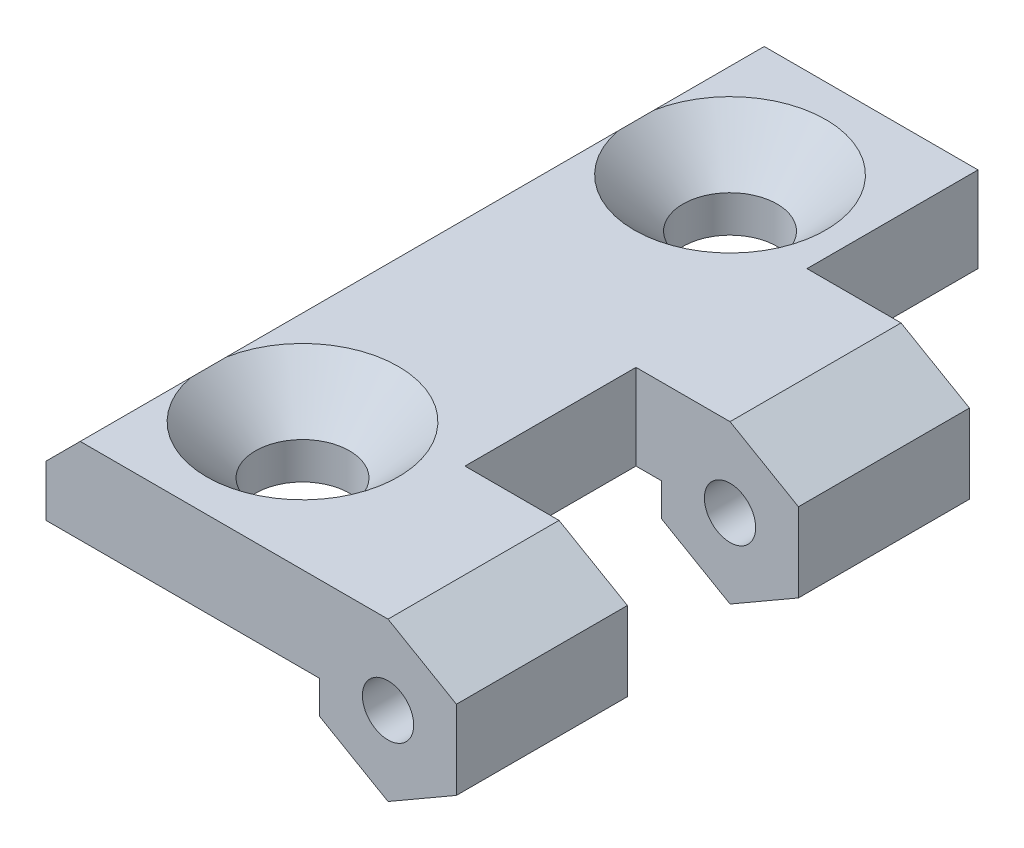
ISO-10303-21;
HEADER;
FILE_DESCRIPTION(('STEP AP214'),'2;1');
FILE_NAME('part.step','',(''),(''),'','','');
FILE_SCHEMA(('AUTOMOTIVE_DESIGN { 1 0 10303 214 1 1 1 1 }'));
ENDSEC;
DATA;
#1=APPLICATION_CONTEXT('core data for automotive mechanical design processes');
#2=APPLICATION_PROTOCOL_DEFINITION('international standard','automotive_design',2000,#1);
#3=PRODUCT_CONTEXT('',#1,'mechanical');
#4=PRODUCT('Part','Part','',(#3));
#5=PRODUCT_RELATED_PRODUCT_CATEGORY('part','',(#4));
#6=PRODUCT_DEFINITION_FORMATION('','',#4);
#7=PRODUCT_DEFINITION_CONTEXT('part definition',#1,'design');
#8=PRODUCT_DEFINITION('design','',#6,#7);
#9=PRODUCT_DEFINITION_SHAPE('','',#8);
#10=(LENGTH_UNIT() NAMED_UNIT(*) SI_UNIT(.MILLI.,.METRE.));
#11=(NAMED_UNIT(*) PLANE_ANGLE_UNIT() SI_UNIT($,.RADIAN.));
#12=(NAMED_UNIT(*) SI_UNIT($,.STERADIAN.) SOLID_ANGLE_UNIT());
#13=UNCERTAINTY_MEASURE_WITH_UNIT(LENGTH_MEASURE(1.E-05),#10,'distance_accuracy_value','');
#14=(GEOMETRIC_REPRESENTATION_CONTEXT(3) GLOBAL_UNCERTAINTY_ASSIGNED_CONTEXT((#13)) GLOBAL_UNIT_ASSIGNED_CONTEXT((#10,
#11,#12)) REPRESENTATION_CONTEXT('',''));
#15=CARTESIAN_POINT('',(0.,0.,0.));
#16=DIRECTION('',(0.,0.,1.));
#17=DIRECTION('',(1.,0.,0.));
#18=AXIS2_PLACEMENT_3D('',#15,#16,#17);
#19=CARTESIAN_POINT('',(0.,0.,-10.));
#20=DIRECTION('',(0.,0.,1.));
#21=DIRECTION('',(1.,0.,0.));
#22=AXIS2_PLACEMENT_3D('',#19,#20,#21);
#23=PLANE('',#22);
#24=CARTESIAN_POINT('',(10.,0.381197846482994,-10.));
#25=DIRECTION('',(0.,0.,-1.));
#26=DIRECTION('',(-1.,0.,0.));
#27=AXIS2_PLACEMENT_3D('',#24,#25,#26);
#28=CIRCLE('',#27,1.49999999999999);
#29=CARTESIAN_POINT('',(8.50000000000001,0.381197846482994,-10.));
#30=VERTEX_POINT('',#29);
#31=EDGE_CURVE('E517',#30,#30,#28,.T.);
#32=ORIENTED_EDGE('',*,*,#31,.F.);
#33=EDGE_LOOP('',(#32));
#34=FACE_BOUND('',#33,.T.);
#35=DIRECTION('',(0.,-1.,0.));
#36=VECTOR('',#35,1.);
#37=CARTESIAN_POINT('',(4.5,0.,-10.));
#38=LINE('',#37,#36);
#39=CARTESIAN_POINT('',(4.5,5.,-10.));
#40=VERTEX_POINT('',#39);
#41=CARTESIAN_POINT('',(4.5,0.,-10.));
#42=VERTEX_POINT('',#41);
#43=EDGE_CURVE('E200',#40,#42,#38,.T.);
#44=ORIENTED_EDGE('',*,*,#43,.F.);
#45=DIRECTION('',(-1.,0.,0.));
#46=VECTOR('',#45,1.);
#47=CARTESIAN_POINT('',(10.,5.,-10.));
#48=LINE('',#47,#46);
#49=CARTESIAN_POINT('',(10.,5.,-10.));
#50=VERTEX_POINT('',#49);
#51=EDGE_CURVE('E288',#50,#40,#48,.T.);
#52=ORIENTED_EDGE('',*,*,#51,.F.);
#53=DIRECTION('',(-0.866025403784439,0.499999999999999,0.));
#54=VECTOR('',#53,1.);
#55=CARTESIAN_POINT('',(14.,2.6905989232415,-10.));
#56=LINE('',#55,#54);
#57=CARTESIAN_POINT('',(14.,2.6905989232415,-10.));
#58=VERTEX_POINT('',#57);
#59=EDGE_CURVE('E285',#58,#50,#56,.T.);
#60=ORIENTED_EDGE('',*,*,#59,.F.);
#61=DIRECTION('',(0.,1.,0.));
#62=VECTOR('',#61,1.);
#63=CARTESIAN_POINT('',(14.,-1.92820323027551,-10.));
#64=LINE('',#63,#62);
#65=CARTESIAN_POINT('',(14.,-1.92820323027551,-10.));
#66=VERTEX_POINT('',#65);
#67=EDGE_CURVE('E298',#66,#58,#64,.T.);
#68=ORIENTED_EDGE('',*,*,#67,.F.);
#69=DIRECTION('',(0.866025403784439,0.5,0.));
#70=VECTOR('',#69,1.);
#71=CARTESIAN_POINT('',(10.,-4.23760430703401,-10.));
#72=LINE('',#71,#70);
#73=CARTESIAN_POINT('',(10.,-4.23760430703401,-10.));
#74=VERTEX_POINT('',#73);
#75=EDGE_CURVE('E295',#74,#66,#72,.T.);
#76=ORIENTED_EDGE('',*,*,#75,.F.);
#77=DIRECTION('',(0.866025403784439,-0.5,0.));
#78=VECTOR('',#77,1.);
#79=CARTESIAN_POINT('',(6.,-1.92820323027551,-10.));
#80=LINE('',#79,#78);
#81=CARTESIAN_POINT('',(6.,-1.92820323027551,-10.));
#82=VERTEX_POINT('',#81);
#83=EDGE_CURVE('E292',#82,#74,#80,.T.);
#84=ORIENTED_EDGE('',*,*,#83,.F.);
#85=DIRECTION('',(0.,-1.,0.));
#86=VECTOR('',#85,1.);
#87=CARTESIAN_POINT('',(6.,0.,-10.));
#88=LINE('',#87,#86);
#89=CARTESIAN_POINT('',(6.,0.,-10.));
#90=VERTEX_POINT('',#89);
#91=EDGE_CURVE('E271',#90,#82,#88,.T.);
#92=ORIENTED_EDGE('',*,*,#91,.F.);
#93=DIRECTION('',(1.,0.,0.));
#94=VECTOR('',#93,1.);
#95=CARTESIAN_POINT('',(-10.,0.,-10.));
#96=LINE('',#95,#94);
#97=EDGE_CURVE('E187',#42,#90,#96,.T.);
#98=ORIENTED_EDGE('',*,*,#97,.F.);
#99=EDGE_LOOP('',(#44,#52,#60,#68,#76,#84,#92,#98));
#100=FACE_BOUND('',#99,.T.);
#101=ADVANCED_FACE('F35',(#34,#100),#23,.F.);
#102=CARTESIAN_POINT('',(14.,2.6905989232415,-10.));
#103=DIRECTION('',(0.499999999999999,0.866025403784439,0.));
#104=DIRECTION('',(-0.866025403784439,0.499999999999999,0.));
#105=AXIS2_PLACEMENT_3D('',#102,#103,#104);
#106=PLANE('',#105);
#107=DIRECTION('',(-0.866025403784439,0.499999999999999,0.));
#108=VECTOR('',#107,1.);
#109=CARTESIAN_POINT('',(14.,2.6905989232415,0.));
#110=LINE('',#109,#108);
#111=CARTESIAN_POINT('',(14.,2.6905989232415,0.));
#112=VERTEX_POINT('',#111);
#113=CARTESIAN_POINT('',(10.,5.,0.));
#114=VERTEX_POINT('',#113);
#115=EDGE_CURVE('E284',#112,#114,#110,.T.);
#116=ORIENTED_EDGE('',*,*,#115,.F.);
#117=DIRECTION('',(0.,0.,1.));
#118=VECTOR('',#117,1.);
#119=CARTESIAN_POINT('',(14.,2.6905989232415,-10.));
#120=LINE('',#119,#118);
#121=EDGE_CURVE('E315',#58,#112,#120,.T.);
#122=ORIENTED_EDGE('',*,*,#121,.F.);
#123=ORIENTED_EDGE('',*,*,#59,.T.);
#124=DIRECTION('',(0.,0.,1.));
#125=VECTOR('',#124,1.);
#126=CARTESIAN_POINT('',(10.,5.,-10.));
#127=LINE('',#126,#125);
#128=EDGE_CURVE('E301',#50,#114,#127,.T.);
#129=ORIENTED_EDGE('',*,*,#128,.T.);
#130=EDGE_LOOP('',(#116,#122,#123,#129));
#131=FACE_BOUND('',#130,.T.);
#132=ADVANCED_FACE('F426',(#131),#106,.T.);
#133=CARTESIAN_POINT('',(14.,-1.92820323027551,-10.));
#134=DIRECTION('',(1.,0.,0.));
#135=DIRECTION('',(0.,1.,0.));
#136=AXIS2_PLACEMENT_3D('',#133,#134,#135);
#137=PLANE('',#136);
#138=DIRECTION('',(0.,1.,0.));
#139=VECTOR('',#138,1.);
#140=CARTESIAN_POINT('',(14.,-1.92820323027551,0.));
#141=LINE('',#140,#139);
#142=CARTESIAN_POINT('',(14.,-1.92820323027551,0.));
#143=VERTEX_POINT('',#142);
#144=EDGE_CURVE('E289',#143,#112,#141,.T.);
#145=ORIENTED_EDGE('',*,*,#144,.F.);
#146=DIRECTION('',(0.,0.,1.));
#147=VECTOR('',#146,1.);
#148=CARTESIAN_POINT('',(14.,-1.92820323027551,-10.));
#149=LINE('',#148,#147);
#150=EDGE_CURVE('E318',#66,#143,#149,.T.);
#151=ORIENTED_EDGE('',*,*,#150,.F.);
#152=ORIENTED_EDGE('',*,*,#67,.T.);
#153=ORIENTED_EDGE('',*,*,#121,.T.);
#154=EDGE_LOOP('',(#145,#151,#152,#153));
#155=FACE_BOUND('',#154,.T.);
#156=ADVANCED_FACE('F432',(#155),#137,.T.);
#157=CARTESIAN_POINT('',(10.,-4.23760430703401,-10.));
#158=DIRECTION('',(0.5,-0.866025403784438,0.));
#159=DIRECTION('',(0.866025403784439,0.5,0.));
#160=AXIS2_PLACEMENT_3D('',#157,#158,#159);
#161=PLANE('',#160);
#162=DIRECTION('',(0.866025403784439,0.5,0.));
#163=VECTOR('',#162,1.);
#164=CARTESIAN_POINT('',(10.,-4.23760430703401,0.));
#165=LINE('',#164,#163);
#166=CARTESIAN_POINT('',(10.,-4.23760430703401,0.));
#167=VERTEX_POINT('',#166);
#168=EDGE_CURVE('E310',#167,#143,#165,.T.);
#169=ORIENTED_EDGE('',*,*,#168,.F.);
#170=DIRECTION('',(0.,0.,1.));
#171=VECTOR('',#170,1.);
#172=CARTESIAN_POINT('',(10.,-4.23760430703401,-10.));
#173=LINE('',#172,#171);
#174=EDGE_CURVE('E320',#74,#167,#173,.T.);
#175=ORIENTED_EDGE('',*,*,#174,.F.);
#176=ORIENTED_EDGE('',*,*,#75,.T.);
#177=ORIENTED_EDGE('',*,*,#150,.T.);
#178=EDGE_LOOP('',(#169,#175,#176,#177));
#179=FACE_BOUND('',#178,.T.);
#180=ADVANCED_FACE('F435',(#179),#161,.T.);
#181=CARTESIAN_POINT('',(6.,-1.92820323027551,-10.));
#182=DIRECTION('',(-0.5,-0.866025403784439,0.));
#183=DIRECTION('',(0.866025403784439,-0.5,0.));
#184=AXIS2_PLACEMENT_3D('',#181,#182,#183);
#185=PLANE('',#184);
#186=DIRECTION('',(0.866025403784439,-0.5,0.));
#187=VECTOR('',#186,1.);
#188=CARTESIAN_POINT('',(6.,-1.92820323027551,0.));
#189=LINE('',#188,#187);
#190=CARTESIAN_POINT('',(6.,-1.92820323027551,0.));
#191=VERTEX_POINT('',#190);
#192=EDGE_CURVE('E307',#191,#167,#189,.T.);
#193=ORIENTED_EDGE('',*,*,#192,.F.);
#194=DIRECTION('',(0.,0.,1.));
#195=VECTOR('',#194,1.);
#196=CARTESIAN_POINT('',(6.,-1.92820323027551,-10.));
#197=LINE('',#196,#195);
#198=EDGE_CURVE('E322',#82,#191,#197,.T.);
#199=ORIENTED_EDGE('',*,*,#198,.F.);
#200=ORIENTED_EDGE('',*,*,#83,.T.);
#201=ORIENTED_EDGE('',*,*,#174,.T.);
#202=EDGE_LOOP('',(#193,#199,#200,#201));
#203=FACE_BOUND('',#202,.T.);
#204=ADVANCED_FACE('F439',(#203),#185,.T.);
#205=CARTESIAN_POINT('',(-9.99999999999999,5.,-10.));
#206=DIRECTION('',(-1.,0.,0.));
#207=DIRECTION('',(0.,-1.,0.));
#208=AXIS2_PLACEMENT_3D('',#205,#206,#207);
#209=PLANE('',#208);
#210=DIRECTION('',(0.,-1.,0.));
#211=VECTOR('',#210,1.);
#212=CARTESIAN_POINT('',(-10.,0.,20.));
#213=LINE('',#212,#211);
#214=CARTESIAN_POINT('',(-9.99999999999999,2.99999999999999,20.));
#215=VERTEX_POINT('',#214);
#216=CARTESIAN_POINT('',(-10.,0.,20.));
#217=VERTEX_POINT('',#216);
#218=EDGE_CURVE('E216',#215,#217,#213,.T.);
#219=ORIENTED_EDGE('',*,*,#218,.F.);
#220=DIRECTION('',(0.,0.,-1.));
#221=VECTOR('',#220,1.);
#222=CARTESIAN_POINT('',(-10.,2.99999999999999,-10.));
#223=LINE('',#222,#221);
#224=CARTESIAN_POINT('',(-10.,2.99999999999999,-20.));
#225=VERTEX_POINT('',#224);
#226=EDGE_CURVE('E44',#215,#225,#223,.T.);
#227=ORIENTED_EDGE('',*,*,#226,.T.);
#228=DIRECTION('',(0.,1.,0.));
#229=VECTOR('',#228,1.);
#230=CARTESIAN_POINT('',(-10.,5.,-20.));
#231=LINE('',#230,#229);
#232=CARTESIAN_POINT('',(-10.,0.,-20.));
#233=VERTEX_POINT('',#232);
#234=EDGE_CURVE('E190',#233,#225,#231,.T.);
#235=ORIENTED_EDGE('',*,*,#234,.F.);
#236=DIRECTION('',(0.,0.,-1.));
#237=VECTOR('',#236,1.);
#238=CARTESIAN_POINT('',(-10.,0.,10.));
#239=LINE('',#238,#237);
#240=EDGE_CURVE('E180',#217,#233,#239,.T.);
#241=ORIENTED_EDGE('',*,*,#240,.F.);
#242=EDGE_LOOP('',(#219,#227,#235,#241));
#243=FACE_BOUND('',#242,.T.);
#244=ADVANCED_FACE('F191',(#243),#209,.T.);
#245=CARTESIAN_POINT('',(10.,5.,-10.));
#246=DIRECTION('',(0.,1.,0.));
#247=DIRECTION('',(-1.,0.,0.));
#248=AXIS2_PLACEMENT_3D('',#245,#246,#247);
#249=PLANE('',#248);
#250=DIRECTION('',(1.,0.,0.));
#251=VECTOR('',#250,1.);
#252=CARTESIAN_POINT('',(4.5,5.,-20.));
#253=LINE('',#252,#251);
#254=CARTESIAN_POINT('',(-7.99999999999999,5.,-20.));
#255=VERTEX_POINT('',#254);
#256=CARTESIAN_POINT('',(4.5,5.,-20.));
#257=VERTEX_POINT('',#256);
#258=EDGE_CURVE('E194',#255,#257,#253,.T.);
#259=ORIENTED_EDGE('',*,*,#258,.F.);
#260=DIRECTION('',(0.,0.,1.));
#261=VECTOR('',#260,1.);
#262=CARTESIAN_POINT('',(-7.99999999999999,5.,-10.));
#263=LINE('',#262,#261);
#264=CARTESIAN_POINT('',(-7.99999999999999,5.,-13.5535653751253));
#265=VERTEX_POINT('',#264);
#266=EDGE_CURVE('E338',#255,#265,#263,.T.);
#267=ORIENTED_EDGE('',*,*,#266,.T.);
#268=CARTESIAN_POINT('',(-2.49999999999999,5.,-12.5));
#269=DIRECTION('',(0.,1.,0.));
#270=DIRECTION('',(0.,0.,1.));
#271=AXIS2_PLACEMENT_3D('',#268,#269,#270);
#272=CIRCLE('',#271,5.5999999999699);
#273=CARTESIAN_POINT('',(-7.99999999999999,5.,-11.4464346248747));
#274=VERTEX_POINT('',#273);
#275=EDGE_CURVE('E511',#274,#265,#272,.T.);
#276=ORIENTED_EDGE('',*,*,#275,.F.);
#277=DIRECTION('',(0.,0.,1.));
#278=VECTOR('',#277,1.);
#279=CARTESIAN_POINT('',(-7.99999999999999,5.,-10.));
#280=LINE('',#279,#278);
#281=CARTESIAN_POINT('',(-7.99999999999999,5.,11.4464346248747));
#282=VERTEX_POINT('',#281);
#283=EDGE_CURVE('E336',#274,#282,#280,.T.);
#284=ORIENTED_EDGE('',*,*,#283,.T.);
#285=CARTESIAN_POINT('',(-2.49999999999999,5.,12.5));
#286=DIRECTION('',(0.,1.,0.));
#287=DIRECTION('',(0.,0.,1.));
#288=AXIS2_PLACEMENT_3D('',#285,#286,#287);
#289=CIRCLE('',#288,5.5999999999699);
#290=CARTESIAN_POINT('',(-7.99999999999999,5.,13.5535653751253));
#291=VERTEX_POINT('',#290);
#292=EDGE_CURVE('E333',#291,#282,#289,.T.);
#293=ORIENTED_EDGE('',*,*,#292,.F.);
#294=DIRECTION('',(0.,0.,1.));
#295=VECTOR('',#294,1.);
#296=CARTESIAN_POINT('',(-7.99999999999999,5.,-10.));
#297=LINE('',#296,#295);
#298=CARTESIAN_POINT('',(-7.99999999999999,5.,20.));
#299=VERTEX_POINT('',#298);
#300=EDGE_CURVE('E317',#291,#299,#297,.T.);
#301=ORIENTED_EDGE('',*,*,#300,.T.);
#302=DIRECTION('',(-1.,0.,0.));
#303=VECTOR('',#302,1.);
#304=CARTESIAN_POINT('',(-9.99999999999999,5.,20.));
#305=LINE('',#304,#303);
#306=CARTESIAN_POINT('',(10.,5.,20.));
#307=VERTEX_POINT('',#306);
#308=EDGE_CURVE('E230',#307,#299,#305,.T.);
#309=ORIENTED_EDGE('',*,*,#308,.F.);
#310=DIRECTION('',(0.,0.,-1.));
#311=VECTOR('',#310,1.);
#312=CARTESIAN_POINT('',(10.,5.,20.));
#313=LINE('',#312,#311);
#314=CARTESIAN_POINT('',(10.,5.,10.));
#315=VERTEX_POINT('',#314);
#316=EDGE_CURVE('E232',#307,#315,#313,.T.);
#317=ORIENTED_EDGE('',*,*,#316,.T.);
#318=DIRECTION('',(-1.,0.,0.));
#319=VECTOR('',#318,1.);
#320=CARTESIAN_POINT('',(-9.99999999999999,5.,10.));
#321=LINE('',#320,#319);
#322=CARTESIAN_POINT('',(4.5,5.,10.));
#323=VERTEX_POINT('',#322);
#324=EDGE_CURVE('E218',#315,#323,#321,.T.);
#325=ORIENTED_EDGE('',*,*,#324,.T.);
#326=DIRECTION('',(0.,0.,1.));
#327=VECTOR('',#326,1.);
#328=CARTESIAN_POINT('',(4.5,5.,0.));
#329=LINE('',#328,#327);
#330=CARTESIAN_POINT('',(4.5,5.,0.));
#331=VERTEX_POINT('',#330);
#332=EDGE_CURVE('E275',#331,#323,#329,.T.);
#333=ORIENTED_EDGE('',*,*,#332,.F.);
#334=DIRECTION('',(-1.,0.,0.));
#335=VECTOR('',#334,1.);
#336=CARTESIAN_POINT('',(10.,5.,0.));
#337=LINE('',#336,#335);
#338=EDGE_CURVE('E304',#114,#331,#337,.T.);
#339=ORIENTED_EDGE('',*,*,#338,.F.);
#340=ORIENTED_EDGE('',*,*,#128,.F.);
#341=ORIENTED_EDGE('',*,*,#51,.T.);
#342=DIRECTION('',(0.,0.,1.));
#343=VECTOR('',#342,1.);
#344=CARTESIAN_POINT('',(4.5,5.,-20.));
#345=LINE('',#344,#343);
#346=EDGE_CURVE('E212',#257,#40,#345,.T.);
#347=ORIENTED_EDGE('',*,*,#346,.F.);
#348=EDGE_LOOP('',(#259,#267,#276,#284,#293,#301,#309,#317,#325,#333,#339,#340,#341,#347));
#349=FACE_BOUND('',#348,.T.);
#350=ADVANCED_FACE('F430',(#349),#249,.T.);
#351=CARTESIAN_POINT('',(0.,0.,0.));
#352=DIRECTION('',(0.,0.,1.));
#353=DIRECTION('',(1.,0.,0.));
#354=AXIS2_PLACEMENT_3D('',#351,#352,#353);
#355=PLANE('',#354);
#356=CARTESIAN_POINT('',(10.,0.381197846482994,0.));
#357=DIRECTION('',(0.,0.,1.));
#358=DIRECTION('',(1.,0.,0.));
#359=AXIS2_PLACEMENT_3D('',#356,#357,#358);
#360=CIRCLE('',#359,1.49999999999999);
#361=CARTESIAN_POINT('',(11.5,0.381197846482994,0.));
#362=VERTEX_POINT('',#361);
#363=EDGE_CURVE('E514',#362,#362,#360,.T.);
#364=ORIENTED_EDGE('',*,*,#363,.F.);
#365=EDGE_LOOP('',(#364));
#366=FACE_BOUND('',#365,.T.);
#367=DIRECTION('',(0.,-1.,0.));
#368=VECTOR('',#367,1.);
#369=CARTESIAN_POINT('',(6.,0.,0.));
#370=LINE('',#369,#368);
#371=CARTESIAN_POINT('',(6.,0.,0.));
#372=VERTEX_POINT('',#371);
#373=EDGE_CURVE('E272',#372,#191,#370,.T.);
#374=ORIENTED_EDGE('',*,*,#373,.T.);
#375=ORIENTED_EDGE('',*,*,#192,.T.);
#376=ORIENTED_EDGE('',*,*,#168,.T.);
#377=ORIENTED_EDGE('',*,*,#144,.T.);
#378=ORIENTED_EDGE('',*,*,#115,.T.);
#379=ORIENTED_EDGE('',*,*,#338,.T.);
#380=DIRECTION('',(0.,1.,0.));
#381=VECTOR('',#380,1.);
#382=CARTESIAN_POINT('',(4.5,-1.92820323027551,0.));
#383=LINE('',#382,#381);
#384=CARTESIAN_POINT('',(4.5,0.,0.));
#385=VERTEX_POINT('',#384);
#386=EDGE_CURVE('E282',#385,#331,#383,.T.);
#387=ORIENTED_EDGE('',*,*,#386,.F.);
#388=DIRECTION('',(-1.,0.,0.));
#389=VECTOR('',#388,1.);
#390=CARTESIAN_POINT('',(6.,0.,0.));
#391=LINE('',#390,#389);
#392=EDGE_CURVE('E263',#372,#385,#391,.T.);
#393=ORIENTED_EDGE('',*,*,#392,.F.);
#394=EDGE_LOOP('',(#374,#375,#376,#377,#378,#379,#387,#393));
#395=FACE_BOUND('',#394,.T.);
#396=ADVANCED_FACE('F422',(#366,#395),#355,.T.);
#397=CARTESIAN_POINT('',(4.5,0.,0.));
#398=DIRECTION('',(1.,0.,0.));
#399=DIRECTION('',(0.,1.,0.));
#400=AXIS2_PLACEMENT_3D('',#397,#398,#399);
#401=PLANE('',#400);
#402=DIRECTION('',(0.,0.,1.));
#403=VECTOR('',#402,1.);
#404=CARTESIAN_POINT('',(4.5,0.,0.));
#405=LINE('',#404,#403);
#406=CARTESIAN_POINT('',(4.5,0.,10.));
#407=VERTEX_POINT('',#406);
#408=EDGE_CURVE('E188',#385,#407,#405,.T.);
#409=ORIENTED_EDGE('',*,*,#408,.F.);
#410=ORIENTED_EDGE('',*,*,#386,.T.);
#411=ORIENTED_EDGE('',*,*,#332,.T.);
#412=DIRECTION('',(0.,-1.,0.));
#413=VECTOR('',#412,1.);
#414=CARTESIAN_POINT('',(4.5,5.,10.));
#415=LINE('',#414,#413);
#416=EDGE_CURVE('E279',#323,#407,#415,.T.);
#417=ORIENTED_EDGE('',*,*,#416,.T.);
#418=EDGE_LOOP('',(#409,#410,#411,#417));
#419=FACE_BOUND('',#418,.T.);
#420=ADVANCED_FACE('F418',(#419),#401,.T.);
#421=CARTESIAN_POINT('',(6.,0.,-10.));
#422=DIRECTION('',(1.,0.,0.));
#423=DIRECTION('',(0.,0.,-1.));
#424=AXIS2_PLACEMENT_3D('',#421,#422,#423);
#425=PLANE('',#424);
#426=ORIENTED_EDGE('',*,*,#198,.T.);
#427=ORIENTED_EDGE('',*,*,#373,.F.);
#428=DIRECTION('',(0.,0.,1.));
#429=VECTOR('',#428,1.);
#430=CARTESIAN_POINT('',(6.,0.,-10.));
#431=LINE('',#430,#429);
#432=EDGE_CURVE('E268',#90,#372,#431,.T.);
#433=ORIENTED_EDGE('',*,*,#432,.F.);
#434=ORIENTED_EDGE('',*,*,#91,.T.);
#435=EDGE_LOOP('',(#426,#427,#433,#434));
#436=FACE_BOUND('',#435,.T.);
#437=ADVANCED_FACE('F414',(#436),#425,.F.);
#438=CARTESIAN_POINT('',(0.,0.,0.));
#439=DIRECTION('',(0.,1.,0.));
#440=DIRECTION('',(0.,0.,1.));
#441=AXIS2_PLACEMENT_3D('',#438,#439,#440);
#442=PLANE('',#441);
#443=CARTESIAN_POINT('',(-2.49999999999999,0.,-12.5));
#444=DIRECTION('',(0.,1.,0.));
#445=DIRECTION('',(0.,0.,1.));
#446=AXIS2_PLACEMENT_3D('',#443,#444,#445);
#447=CIRCLE('',#446,2.74999999999999);
#448=CARTESIAN_POINT('',(-2.49999999999999,0.,-9.75000000000002));
#449=VERTEX_POINT('',#448);
#450=EDGE_CURVE('E330',#449,#449,#447,.T.);
#451=ORIENTED_EDGE('',*,*,#450,.T.);
#452=EDGE_LOOP('',(#451));
#453=FACE_BOUND('',#452,.T.);
#454=CARTESIAN_POINT('',(-2.49999999999999,0.,12.5));
#455=DIRECTION('',(0.,1.,0.));
#456=DIRECTION('',(0.,0.,1.));
#457=AXIS2_PLACEMENT_3D('',#454,#455,#456);
#458=CIRCLE('',#457,2.74999999999999);
#459=CARTESIAN_POINT('',(-2.49999999999999,0.,15.25));
#460=VERTEX_POINT('',#459);
#461=EDGE_CURVE('E325',#460,#460,#458,.T.);
#462=ORIENTED_EDGE('',*,*,#461,.T.);
#463=EDGE_LOOP('',(#462));
#464=FACE_BOUND('',#463,.T.);
#465=ORIENTED_EDGE('',*,*,#392,.T.);
#466=ORIENTED_EDGE('',*,*,#408,.T.);
#467=DIRECTION('',(1.,0.,0.));
#468=VECTOR('',#467,1.);
#469=CARTESIAN_POINT('',(6.,0.,10.));
#470=LINE('',#469,#468);
#471=CARTESIAN_POINT('',(6.,0.,10.));
#472=VERTEX_POINT('',#471);
#473=EDGE_CURVE('E215',#407,#472,#470,.T.);
#474=ORIENTED_EDGE('',*,*,#473,.T.);
#475=DIRECTION('',(0.,0.,-1.));
#476=VECTOR('',#475,1.);
#477=CARTESIAN_POINT('',(6.,0.,20.));
#478=LINE('',#477,#476);
#479=CARTESIAN_POINT('',(6.,0.,20.));
#480=VERTEX_POINT('',#479);
#481=EDGE_CURVE('E260',#480,#472,#478,.T.);
#482=ORIENTED_EDGE('',*,*,#481,.F.);
#483=DIRECTION('',(1.,0.,0.));
#484=VECTOR('',#483,1.);
#485=CARTESIAN_POINT('',(6.,0.,20.));
#486=LINE('',#485,#484);
#487=EDGE_CURVE('E186',#217,#480,#486,.T.);
#488=ORIENTED_EDGE('',*,*,#487,.F.);
#489=ORIENTED_EDGE('',*,*,#240,.T.);
#490=DIRECTION('',(-1.,0.,0.));
#491=VECTOR('',#490,1.);
#492=CARTESIAN_POINT('',(-10.,0.,-20.));
#493=LINE('',#492,#491);
#494=CARTESIAN_POINT('',(4.5,0.,-20.));
#495=VERTEX_POINT('',#494);
#496=EDGE_CURVE('E184',#495,#233,#493,.T.);
#497=ORIENTED_EDGE('',*,*,#496,.F.);
#498=DIRECTION('',(0.,0.,1.));
#499=VECTOR('',#498,1.);
#500=CARTESIAN_POINT('',(4.5,0.,-20.));
#501=LINE('',#500,#499);
#502=EDGE_CURVE('E209',#495,#42,#501,.T.);
#503=ORIENTED_EDGE('',*,*,#502,.T.);
#504=ORIENTED_EDGE('',*,*,#97,.T.);
#505=ORIENTED_EDGE('',*,*,#432,.T.);
#506=EDGE_LOOP('',(#465,#466,#474,#482,#488,#489,#497,#503,#504,#505));
#507=FACE_BOUND('',#506,.T.);
#508=ADVANCED_FACE('F181',(#453,#464,#507),#442,.F.);
#509=CARTESIAN_POINT('',(0.,0.,10.));
#510=DIRECTION('',(0.,0.,-1.));
#511=DIRECTION('',(-1.,0.,0.));
#512=AXIS2_PLACEMENT_3D('',#509,#510,#511);
#513=PLANE('',#512);
#514=CARTESIAN_POINT('',(10.,0.381197846482994,10.));
#515=DIRECTION('',(0.,0.,-1.));
#516=DIRECTION('',(-1.,0.,0.));
#517=AXIS2_PLACEMENT_3D('',#514,#515,#516);
#518=CIRCLE('',#517,1.49999999999999);
#519=CARTESIAN_POINT('',(8.50000000000001,0.381197846482994,10.));
#520=VERTEX_POINT('',#519);
#521=EDGE_CURVE('E328',#520,#520,#518,.T.);
#522=ORIENTED_EDGE('',*,*,#521,.F.);
#523=EDGE_LOOP('',(#522));
#524=FACE_BOUND('',#523,.T.);
#525=ORIENTED_EDGE('',*,*,#416,.F.);
#526=ORIENTED_EDGE('',*,*,#324,.F.);
#527=DIRECTION('',(-0.866025403784439,0.5,0.));
#528=VECTOR('',#527,1.);
#529=CARTESIAN_POINT('',(10.,5.,10.));
#530=LINE('',#529,#528);
#531=CARTESIAN_POINT('',(14.,2.6905989232415,10.));
#532=VERTEX_POINT('',#531);
#533=EDGE_CURVE('E242',#532,#315,#530,.T.);
#534=ORIENTED_EDGE('',*,*,#533,.F.);
#535=DIRECTION('',(0.,1.,0.));
#536=VECTOR('',#535,1.);
#537=CARTESIAN_POINT('',(14.,2.6905989232415,10.));
#538=LINE('',#537,#536);
#539=CARTESIAN_POINT('',(14.,-1.92820323027551,10.));
#540=VERTEX_POINT('',#539);
#541=EDGE_CURVE('E240',#540,#532,#538,.T.);
#542=ORIENTED_EDGE('',*,*,#541,.F.);
#543=DIRECTION('',(0.866025403784438,0.5,0.));
#544=VECTOR('',#543,1.);
#545=CARTESIAN_POINT('',(14.,-1.92820323027551,10.));
#546=LINE('',#545,#544);
#547=CARTESIAN_POINT('',(10.,-4.23760430703401,10.));
#548=VERTEX_POINT('',#547);
#549=EDGE_CURVE('E238',#548,#540,#546,.T.);
#550=ORIENTED_EDGE('',*,*,#549,.F.);
#551=DIRECTION('',(0.866025403784439,-0.5,0.));
#552=VECTOR('',#551,1.);
#553=CARTESIAN_POINT('',(10.,-4.23760430703401,10.));
#554=LINE('',#553,#552);
#555=CARTESIAN_POINT('',(6.,-1.92820323027551,10.));
#556=VERTEX_POINT('',#555);
#557=EDGE_CURVE('E236',#556,#548,#554,.T.);
#558=ORIENTED_EDGE('',*,*,#557,.F.);
#559=DIRECTION('',(0.,-1.,0.));
#560=VECTOR('',#559,1.);
#561=CARTESIAN_POINT('',(6.,-1.92820323027551,10.));
#562=LINE('',#561,#560);
#563=EDGE_CURVE('E234',#472,#556,#562,.T.);
#564=ORIENTED_EDGE('',*,*,#563,.F.);
#565=ORIENTED_EDGE('',*,*,#473,.F.);
#566=EDGE_LOOP('',(#525,#526,#534,#542,#550,#558,#564,#565));
#567=FACE_BOUND('',#566,.T.);
#568=ADVANCED_FACE('F389',(#524,#567),#513,.T.);
#569=CARTESIAN_POINT('',(6.,-1.92820323027551,20.));
#570=DIRECTION('',(1.,0.,0.));
#571=DIRECTION('',(0.,1.,0.));
#572=AXIS2_PLACEMENT_3D('',#569,#570,#571);
#573=PLANE('',#572);
#574=ORIENTED_EDGE('',*,*,#563,.T.);
#575=DIRECTION('',(0.,0.,-1.));
#576=VECTOR('',#575,1.);
#577=CARTESIAN_POINT('',(6.,-1.92820323027551,20.));
#578=LINE('',#577,#576);
#579=CARTESIAN_POINT('',(6.,-1.92820323027551,20.));
#580=VERTEX_POINT('',#579);
#581=EDGE_CURVE('E257',#580,#556,#578,.T.);
#582=ORIENTED_EDGE('',*,*,#581,.F.);
#583=DIRECTION('',(0.,-1.,0.));
#584=VECTOR('',#583,1.);
#585=CARTESIAN_POINT('',(6.,-1.92820323027551,20.));
#586=LINE('',#585,#584);
#587=EDGE_CURVE('E220',#480,#580,#586,.T.);
#588=ORIENTED_EDGE('',*,*,#587,.F.);
#589=ORIENTED_EDGE('',*,*,#481,.T.);
#590=EDGE_LOOP('',(#574,#582,#588,#589));
#591=FACE_BOUND('',#590,.T.);
#592=ADVANCED_FACE('F392',(#591),#573,.F.);
#593=CARTESIAN_POINT('',(10.,-4.23760430703401,20.));
#594=DIRECTION('',(0.5,0.866025403784439,0.));
#595=DIRECTION('',(-0.866025403784439,0.5,0.));
#596=AXIS2_PLACEMENT_3D('',#593,#594,#595);
#597=PLANE('',#596);
#598=ORIENTED_EDGE('',*,*,#557,.T.);
#599=DIRECTION('',(0.,0.,-1.));
#600=VECTOR('',#599,1.);
#601=CARTESIAN_POINT('',(10.,-4.23760430703401,20.));
#602=LINE('',#601,#600);
#603=CARTESIAN_POINT('',(10.,-4.23760430703401,20.));
#604=VERTEX_POINT('',#603);
#605=EDGE_CURVE('E254',#604,#548,#602,.T.);
#606=ORIENTED_EDGE('',*,*,#605,.F.);
#607=DIRECTION('',(0.866025403784439,-0.5,0.));
#608=VECTOR('',#607,1.);
#609=CARTESIAN_POINT('',(10.,-4.23760430703401,20.));
#610=LINE('',#609,#608);
#611=EDGE_CURVE('E222',#580,#604,#610,.T.);
#612=ORIENTED_EDGE('',*,*,#611,.F.);
#613=ORIENTED_EDGE('',*,*,#581,.T.);
#614=EDGE_LOOP('',(#598,#606,#612,#613));
#615=FACE_BOUND('',#614,.T.);
#616=ADVANCED_FACE('F404',(#615),#597,.F.);
#617=CARTESIAN_POINT('',(14.,-1.92820323027551,20.));
#618=DIRECTION('',(-0.5,0.866025403784438,0.));
#619=DIRECTION('',(-0.866025403784438,-0.5,0.));
#620=AXIS2_PLACEMENT_3D('',#617,#618,#619);
#621=PLANE('',#620);
#622=ORIENTED_EDGE('',*,*,#549,.T.);
#623=DIRECTION('',(0.,0.,-1.));
#624=VECTOR('',#623,1.);
#625=CARTESIAN_POINT('',(14.,-1.92820323027551,20.));
#626=LINE('',#625,#624);
#627=CARTESIAN_POINT('',(14.,-1.92820323027551,20.));
#628=VERTEX_POINT('',#627);
#629=EDGE_CURVE('E251',#628,#540,#626,.T.);
#630=ORIENTED_EDGE('',*,*,#629,.F.);
#631=DIRECTION('',(0.866025403784438,0.5,0.));
#632=VECTOR('',#631,1.);
#633=CARTESIAN_POINT('',(14.,-1.92820323027551,20.));
#634=LINE('',#633,#632);
#635=EDGE_CURVE('E224',#604,#628,#634,.T.);
#636=ORIENTED_EDGE('',*,*,#635,.F.);
#637=ORIENTED_EDGE('',*,*,#605,.T.);
#638=EDGE_LOOP('',(#622,#630,#636,#637));
#639=FACE_BOUND('',#638,.T.);
#640=ADVANCED_FACE('F400',(#639),#621,.F.);
#641=CARTESIAN_POINT('',(14.,2.6905989232415,20.));
#642=DIRECTION('',(-1.,0.,0.));
#643=DIRECTION('',(0.,0.,1.));
#644=AXIS2_PLACEMENT_3D('',#641,#642,#643);
#645=PLANE('',#644);
#646=ORIENTED_EDGE('',*,*,#541,.T.);
#647=DIRECTION('',(0.,0.,-1.));
#648=VECTOR('',#647,1.);
#649=CARTESIAN_POINT('',(14.,2.6905989232415,20.));
#650=LINE('',#649,#648);
#651=CARTESIAN_POINT('',(14.,2.6905989232415,20.));
#652=VERTEX_POINT('',#651);
#653=EDGE_CURVE('E248',#652,#532,#650,.T.);
#654=ORIENTED_EDGE('',*,*,#653,.F.);
#655=DIRECTION('',(0.,1.,0.));
#656=VECTOR('',#655,1.);
#657=CARTESIAN_POINT('',(14.,2.6905989232415,20.));
#658=LINE('',#657,#656);
#659=EDGE_CURVE('E226',#628,#652,#658,.T.);
#660=ORIENTED_EDGE('',*,*,#659,.F.);
#661=ORIENTED_EDGE('',*,*,#629,.T.);
#662=EDGE_LOOP('',(#646,#654,#660,#661));
#663=FACE_BOUND('',#662,.T.);
#664=ADVANCED_FACE('F396',(#663),#645,.F.);
#665=CARTESIAN_POINT('',(10.,5.,20.));
#666=DIRECTION('',(-0.5,-0.866025403784439,0.));
#667=DIRECTION('',(0.866025403784439,-0.5,0.));
#668=AXIS2_PLACEMENT_3D('',#665,#666,#667);
#669=PLANE('',#668);
#670=ORIENTED_EDGE('',*,*,#533,.T.);
#671=ORIENTED_EDGE('',*,*,#316,.F.);
#672=DIRECTION('',(-0.866025403784439,0.5,0.));
#673=VECTOR('',#672,1.);
#674=CARTESIAN_POINT('',(10.,5.,20.));
#675=LINE('',#674,#673);
#676=EDGE_CURVE('E228',#652,#307,#675,.T.);
#677=ORIENTED_EDGE('',*,*,#676,.F.);
#678=ORIENTED_EDGE('',*,*,#653,.T.);
#679=EDGE_LOOP('',(#670,#671,#677,#678));
#680=FACE_BOUND('',#679,.T.);
#681=ADVANCED_FACE('F387',(#680),#669,.F.);
#682=CARTESIAN_POINT('',(0.,0.,20.));
#683=DIRECTION('',(0.,0.,-1.));
#684=DIRECTION('',(-1.,0.,0.));
#685=AXIS2_PLACEMENT_3D('',#682,#683,#684);
#686=PLANE('',#685);
#687=CARTESIAN_POINT('',(10.,0.381197846482994,20.));
#688=DIRECTION('',(0.,0.,-1.));
#689=DIRECTION('',(-1.,0.,0.));
#690=AXIS2_PLACEMENT_3D('',#687,#688,#689);
#691=CIRCLE('',#690,1.49999999999999);
#692=CARTESIAN_POINT('',(8.50000000000001,0.381197846482994,20.));
#693=VERTEX_POINT('',#692);
#694=EDGE_CURVE('E203',#693,#693,#691,.T.);
#695=ORIENTED_EDGE('',*,*,#694,.T.);
#696=EDGE_LOOP('',(#695));
#697=FACE_BOUND('',#696,.T.);
#698=ORIENTED_EDGE('',*,*,#308,.T.);
#699=DIRECTION('',(0.707106781186547,0.707106781186548,0.));
#700=VECTOR('',#699,1.);
#701=CARTESIAN_POINT('',(-7.99999999999999,5.,20.));
#702=LINE('',#701,#700);
#703=EDGE_CURVE('E58',#299,#215,#702,.F.);
#704=ORIENTED_EDGE('',*,*,#703,.T.);
#705=ORIENTED_EDGE('',*,*,#218,.T.);
#706=ORIENTED_EDGE('',*,*,#487,.T.);
#707=ORIENTED_EDGE('',*,*,#587,.T.);
#708=ORIENTED_EDGE('',*,*,#611,.T.);
#709=ORIENTED_EDGE('',*,*,#635,.T.);
#710=ORIENTED_EDGE('',*,*,#659,.T.);
#711=ORIENTED_EDGE('',*,*,#676,.T.);
#712=EDGE_LOOP('',(#698,#704,#705,#706,#707,#708,#709,#710,#711));
#713=FACE_BOUND('',#712,.T.);
#714=ADVANCED_FACE('F383',(#697,#713),#686,.F.);
#715=CARTESIAN_POINT('',(4.5,0.,-20.));
#716=DIRECTION('',(-1.,0.,0.));
#717=DIRECTION('',(0.,0.,1.));
#718=AXIS2_PLACEMENT_3D('',#715,#716,#717);
#719=PLANE('',#718);
#720=ORIENTED_EDGE('',*,*,#43,.T.);
#721=ORIENTED_EDGE('',*,*,#502,.F.);
#722=DIRECTION('',(0.,-1.,0.));
#723=VECTOR('',#722,1.);
#724=CARTESIAN_POINT('',(4.5,0.,-20.));
#725=LINE('',#724,#723);
#726=EDGE_CURVE('E198',#257,#495,#725,.T.);
#727=ORIENTED_EDGE('',*,*,#726,.F.);
#728=ORIENTED_EDGE('',*,*,#346,.T.);
#729=EDGE_LOOP('',(#720,#721,#727,#728));
#730=FACE_BOUND('',#729,.T.);
#731=ADVANCED_FACE('F380',(#730),#719,.F.);
#732=CARTESIAN_POINT('',(0.,0.,-20.));
#733=DIRECTION('',(0.,0.,1.));
#734=DIRECTION('',(1.,0.,0.));
#735=AXIS2_PLACEMENT_3D('',#732,#733,#734);
#736=PLANE('',#735);
#737=ORIENTED_EDGE('',*,*,#234,.T.);
#738=DIRECTION('',(-0.707106781186547,-0.707106781186548,0.));
#739=VECTOR('',#738,1.);
#740=CARTESIAN_POINT('',(-7.99999999999999,5.,-20.));
#741=LINE('',#740,#739);
#742=EDGE_CURVE('E11',#225,#255,#741,.F.);
#743=ORIENTED_EDGE('',*,*,#742,.T.);
#744=ORIENTED_EDGE('',*,*,#258,.T.);
#745=ORIENTED_EDGE('',*,*,#726,.T.);
#746=ORIENTED_EDGE('',*,*,#496,.T.);
#747=EDGE_LOOP('',(#737,#743,#744,#745,#746));
#748=FACE_BOUND('',#747,.T.);
#749=ADVANCED_FACE('F196',(#748),#736,.F.);
#750=CARTESIAN_POINT('',(10.,0.381197846482994,10.));
#751=DIRECTION('',(0.,0.,-1.));
#752=DIRECTION('',(-1.,0.,0.));
#753=AXIS2_PLACEMENT_3D('',#750,#751,#752);
#754=CYLINDRICAL_SURFACE('',#753,1.49999999999999);
#755=ORIENTED_EDGE('',*,*,#694,.F.);
#756=EDGE_LOOP('',(#755));
#757=FACE_BOUND('',#756,.T.);
#758=ORIENTED_EDGE('',*,*,#521,.T.);
#759=EDGE_LOOP('',(#758));
#760=FACE_BOUND('',#759,.T.);
#761=ADVANCED_FACE('F373',(#757,#760),#754,.F.);
#762=CARTESIAN_POINT('',(-2.49999999999999,5.,12.5));
#763=DIRECTION('',(0.,1.,0.));
#764=DIRECTION('',(0.,0.,1.));
#765=AXIS2_PLACEMENT_3D('',#762,#763,#764);
#766=CYLINDRICAL_SURFACE('',#765,2.74999999999999);
#767=CARTESIAN_POINT('',(-2.49999999999999,2.14999999997327,12.5));
#768=DIRECTION('',(0.,1.,0.));
#769=DIRECTION('',(0.,0.,1.));
#770=AXIS2_PLACEMENT_3D('',#767,#768,#769);
#771=CIRCLE('',#770,2.74999999999999);
#772=CARTESIAN_POINT('',(-2.49999999999999,2.14999999997327,15.25));
#773=VERTEX_POINT('',#772);
#774=EDGE_CURVE('E329',#773,#773,#771,.T.);
#775=ORIENTED_EDGE('',*,*,#774,.T.);
#776=EDGE_LOOP('',(#775));
#777=FACE_BOUND('',#776,.T.);
#778=ORIENTED_EDGE('',*,*,#461,.F.);
#779=EDGE_LOOP('',(#778));
#780=FACE_BOUND('',#779,.T.);
#781=ADVANCED_FACE('F369',(#777,#780),#766,.F.);
#782=CARTESIAN_POINT('',(-2.49999999999999,5.,12.5));
#783=DIRECTION('',(0.,1.,0.));
#784=DIRECTION('',(0.,0.,1.));
#785=AXIS2_PLACEMENT_3D('',#782,#783,#784);
#786=CONICAL_SURFACE('',#785,5.5999999999699,0.785398163387479);
#787=ORIENTED_EDGE('',*,*,#774,.F.);
#788=EDGE_LOOP('',(#787));
#789=FACE_BOUND('',#788,.T.);
#790=ORIENTED_EDGE('',*,*,#292,.T.);
#791=CARTESIAN_POINT('',(-7.99999999999999,5.,11.4464346248747));
#792=CARTESIAN_POINT('',(-8.03333333332362,4.96666666667637,11.7976230832498));
#793=CARTESIAN_POINT('',(-8.04999999998544,4.95000000001455,12.1488115416249));
#794=CARTESIAN_POINT('',(-8.04999999998544,4.95000000001455,12.8511884583751));
#795=CARTESIAN_POINT('',(-8.03333333332362,4.96666666667637,13.2023769167502));
#796=CARTESIAN_POINT('',(-7.99999999999999,5.,13.5535653751253));
#797=B_SPLINE_CURVE_WITH_KNOTS('',3,(#791,#792,#793,#794,#795,#796),.UNSPECIFIED.,.F.,.F.,(4,2,
4),(0.,1.05593560393611,2.11187120787222),.UNSPECIFIED.);
#798=EDGE_CURVE('E348',#282,#291,#797,.T.);
#799=ORIENTED_EDGE('',*,*,#798,.T.);
#800=EDGE_LOOP('',(#790,#799));
#801=FACE_BOUND('',#800,.T.);
#802=ADVANCED_FACE('F364',(#789,#801),#786,.F.);
#803=CARTESIAN_POINT('',(-2.49999999999999,5.,-12.5));
#804=DIRECTION('',(0.,1.,0.));
#805=DIRECTION('',(0.,0.,1.));
#806=AXIS2_PLACEMENT_3D('',#803,#804,#805);
#807=CYLINDRICAL_SURFACE('',#806,2.74999999999999);
#808=CARTESIAN_POINT('',(-2.49999999999999,2.14999999997327,-12.5));
#809=DIRECTION('',(0.,1.,0.));
#810=DIRECTION('',(0.,0.,1.));
#811=AXIS2_PLACEMENT_3D('',#808,#809,#810);
#812=CIRCLE('',#811,2.74999999999999);
#813=CARTESIAN_POINT('',(-2.49999999999999,2.14999999997327,-9.75000000000001));
#814=VERTEX_POINT('',#813);
#815=EDGE_CURVE('E334',#814,#814,#812,.T.);
#816=ORIENTED_EDGE('',*,*,#815,.T.);
#817=EDGE_LOOP('',(#816));
#818=FACE_BOUND('',#817,.T.);
#819=ORIENTED_EDGE('',*,*,#450,.F.);
#820=EDGE_LOOP('',(#819));
#821=FACE_BOUND('',#820,.T.);
#822=ADVANCED_FACE('F361',(#818,#821),#807,.F.);
#823=CARTESIAN_POINT('',(-2.49999999999999,5.,-12.5));
#824=DIRECTION('',(0.,1.,0.));
#825=DIRECTION('',(0.,0.,1.));
#826=AXIS2_PLACEMENT_3D('',#823,#824,#825);
#827=CONICAL_SURFACE('',#826,5.5999999999699,0.785398163387479);
#828=ORIENTED_EDGE('',*,*,#815,.F.);
#829=EDGE_LOOP('',(#828));
#830=FACE_BOUND('',#829,.T.);
#831=ORIENTED_EDGE('',*,*,#275,.T.);
#832=CARTESIAN_POINT('',(-7.99999999999999,5.,-13.5535653751253));
#833=CARTESIAN_POINT('',(-8.03333333332362,4.96666666667637,-13.2023769167502));
#834=CARTESIAN_POINT('',(-8.04999999998544,4.95000000001455,-12.8511884583751));
#835=CARTESIAN_POINT('',(-8.04999999998544,4.95000000001455,-12.1488115416249));
#836=CARTESIAN_POINT('',(-8.03333333332362,4.96666666667637,-11.7976230832498));
#837=CARTESIAN_POINT('',(-7.99999999999999,5.,-11.4464346248747));
#838=B_SPLINE_CURVE_WITH_KNOTS('',3,(#832,#833,#834,#835,#836,#837),.UNSPECIFIED.,.F.,.F.,(4,2,
4),(0.,1.05593560393612,2.11187120787224),.UNSPECIFIED.);
#839=EDGE_CURVE('E341',#265,#274,#838,.T.);
#840=ORIENTED_EDGE('',*,*,#839,.T.);
#841=EDGE_LOOP('',(#831,#840));
#842=FACE_BOUND('',#841,.T.);
#843=ADVANCED_FACE('F355',(#830,#842),#827,.F.);
#844=CARTESIAN_POINT('',(10.,0.381197846482994,-10.));
#845=DIRECTION('',(0.,0.,-1.));
#846=DIRECTION('',(-1.,0.,0.));
#847=AXIS2_PLACEMENT_3D('',#844,#845,#846);
#848=CYLINDRICAL_SURFACE('',#847,1.49999999999999);
#849=ORIENTED_EDGE('',*,*,#363,.T.);
#850=EDGE_LOOP('',(#849));
#851=FACE_BOUND('',#850,.T.);
#852=ORIENTED_EDGE('',*,*,#31,.T.);
#853=EDGE_LOOP('',(#852));
#854=FACE_BOUND('',#853,.T.);
#855=ADVANCED_FACE('F360',(#851,#854),#848,.F.);
#856=CARTESIAN_POINT('',(-7.99999999999999,5.,-10.));
#857=DIRECTION('',(0.707106781186548,-0.707106781186547,0.));
#858=DIRECTION('',(0.,0.,1.));
#859=AXIS2_PLACEMENT_3D('',#856,#857,#858);
#860=PLANE('',#859);
#861=ORIENTED_EDGE('',*,*,#742,.F.);
#862=ORIENTED_EDGE('',*,*,#226,.F.);
#863=ORIENTED_EDGE('',*,*,#703,.F.);
#864=ORIENTED_EDGE('',*,*,#300,.F.);
#865=ORIENTED_EDGE('',*,*,#798,.F.);
#866=ORIENTED_EDGE('',*,*,#283,.F.);
#867=ORIENTED_EDGE('',*,*,#839,.F.);
#868=ORIENTED_EDGE('',*,*,#266,.F.);
#869=EDGE_LOOP('',(#861,#862,#863,#864,#865,#866,#867,#868));
#870=FACE_BOUND('',#869,.T.);
#871=ADVANCED_FACE('F37',(#870),#860,.F.);
#872=CLOSED_SHELL('',(#101,#132,#156,#180,#204,#244,#350,#396,#420,#437,#508,#568,#592,#616,
#640,#664,#681,#714,#731,#749,#761,#781,#802,#822,#843,#855,#871));
#873=MANIFOLD_SOLID_BREP('B2',#872);
#874=ADVANCED_BREP_SHAPE_REPRESENTATION('',(#18,#873),#14);
#875=SHAPE_DEFINITION_REPRESENTATION(#9,#874);
ENDSEC;
END-ISO-10303-21;
